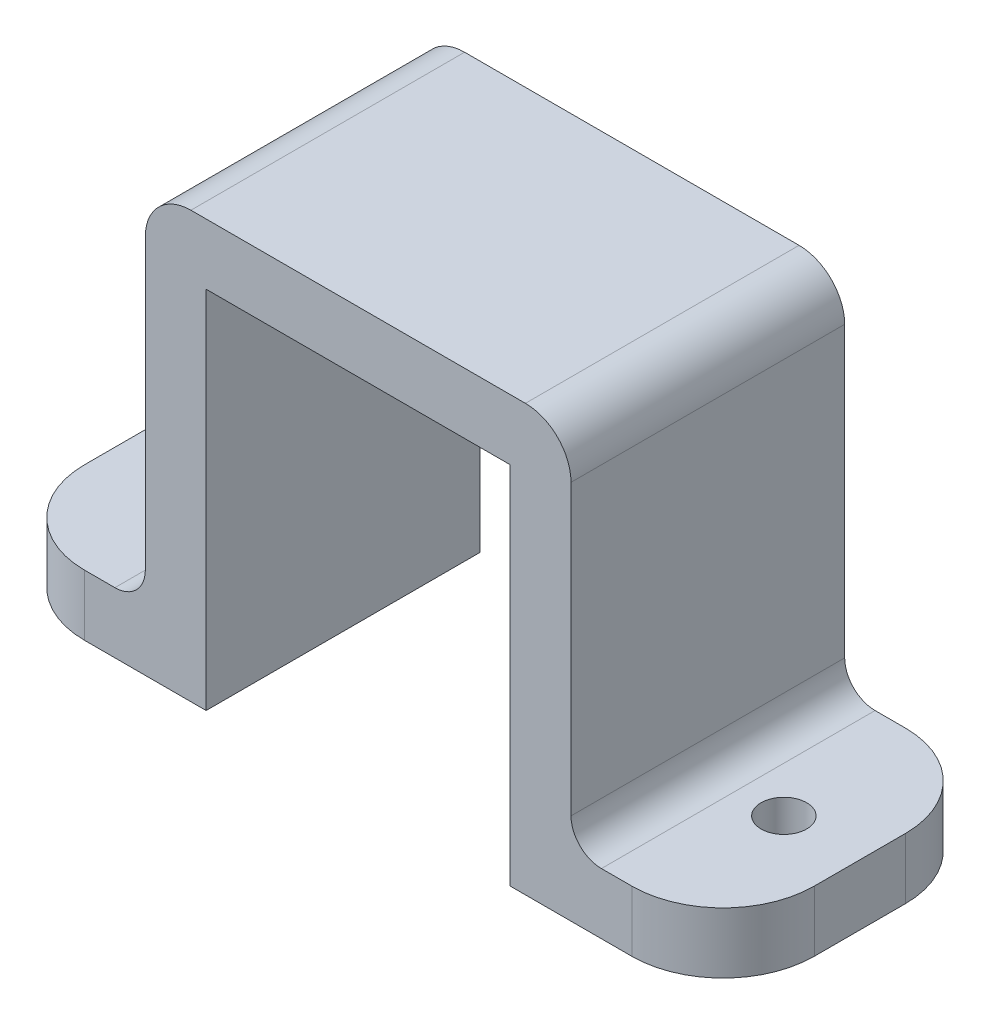
ISO-10303-21;
HEADER;
FILE_DESCRIPTION(('STEP AP214'),'2;1');
FILE_NAME('part.step','',(''),(''),'','','');
FILE_SCHEMA(('AUTOMOTIVE_DESIGN { 1 0 10303 214 1 1 1 1 }'));
ENDSEC;
DATA;
#1=APPLICATION_CONTEXT('core data for automotive mechanical design processes');
#2=APPLICATION_PROTOCOL_DEFINITION('international standard','automotive_design',2000,#1);
#3=PRODUCT_CONTEXT('',#1,'mechanical');
#4=PRODUCT('Part','Part','',(#3));
#5=PRODUCT_RELATED_PRODUCT_CATEGORY('part','',(#4));
#6=PRODUCT_DEFINITION_FORMATION('','',#4);
#7=PRODUCT_DEFINITION_CONTEXT('part definition',#1,'design');
#8=PRODUCT_DEFINITION('design','',#6,#7);
#9=PRODUCT_DEFINITION_SHAPE('','',#8);
#10=(LENGTH_UNIT() NAMED_UNIT(*) SI_UNIT(.MILLI.,.METRE.));
#11=(NAMED_UNIT(*) PLANE_ANGLE_UNIT() SI_UNIT($,.RADIAN.));
#12=(NAMED_UNIT(*) SI_UNIT($,.STERADIAN.) SOLID_ANGLE_UNIT());
#13=UNCERTAINTY_MEASURE_WITH_UNIT(LENGTH_MEASURE(1.E-05),#10,'distance_accuracy_value','');
#14=(GEOMETRIC_REPRESENTATION_CONTEXT(3) GLOBAL_UNCERTAINTY_ASSIGNED_CONTEXT((#13)) GLOBAL_UNIT_ASSIGNED_CONTEXT((#10,
#11,#12)) REPRESENTATION_CONTEXT('',''));
#15=CARTESIAN_POINT('',(0.,0.,0.));
#16=DIRECTION('',(0.,0.,1.));
#17=DIRECTION('',(1.,0.,0.));
#18=AXIS2_PLACEMENT_3D('',#15,#16,#17);
#19=CARTESIAN_POINT('',(0.,0.,9.));
#20=DIRECTION('',(0.,1.,0.));
#21=DIRECTION('',(-1.,0.,0.));
#22=AXIS2_PLACEMENT_3D('',#19,#20,#21);
#23=PLANE('',#22);
#24=CARTESIAN_POINT('',(-4.5,0.,4.5));
#25=DIRECTION('',(0.,1.,0.));
#26=DIRECTION('',(-1.,0.,0.));
#27=AXIS2_PLACEMENT_3D('',#24,#25,#26);
#28=CIRCLE('',#27,0.75);
#29=CARTESIAN_POINT('',(-5.25,0.,4.5));
#30=VERTEX_POINT('',#29);
#31=EDGE_CURVE('E663',#30,#30,#28,.T.);
#32=ORIENTED_EDGE('',*,*,#31,.T.);
#33=EDGE_LOOP('',(#32));
#34=FACE_BOUND('',#33,.T.);
#35=DIRECTION('',(0.,0.,-1.));
#36=VECTOR('',#35,1.);
#37=CARTESIAN_POINT('',(-7.,0.,9.));
#38=LINE('',#37,#36);
#39=CARTESIAN_POINT('',(-7.,0.,6.));
#40=VERTEX_POINT('',#39);
#41=CARTESIAN_POINT('',(-7.,0.,3.));
#42=VERTEX_POINT('',#41);
#43=EDGE_CURVE('E325',#40,#42,#38,.T.);
#44=ORIENTED_EDGE('',*,*,#43,.T.);
#45=CARTESIAN_POINT('',(-4.,0.,3.));
#46=DIRECTION('',(0.,1.,0.));
#47=DIRECTION('',(-1.,0.,0.));
#48=AXIS2_PLACEMENT_3D('',#45,#46,#47);
#49=CIRCLE('',#48,3.);
#50=CARTESIAN_POINT('',(-4.,0.,0.));
#51=VERTEX_POINT('',#50);
#52=EDGE_CURVE('E221',#42,#51,#49,.F.);
#53=ORIENTED_EDGE('',*,*,#52,.T.);
#54=DIRECTION('',(1.,0.,0.));
#55=VECTOR('',#54,1.);
#56=CARTESIAN_POINT('',(0.,0.,0.));
#57=LINE('',#56,#55);
#58=CARTESIAN_POINT('',(0.,0.,0.));
#59=VERTEX_POINT('',#58);
#60=EDGE_CURVE('E202',#51,#59,#57,.T.);
#61=ORIENTED_EDGE('',*,*,#60,.T.);
#62=DIRECTION('',(0.,0.,-1.));
#63=VECTOR('',#62,1.);
#64=CARTESIAN_POINT('',(0.,0.,9.));
#65=LINE('',#64,#63);
#66=CARTESIAN_POINT('',(0.,0.,9.));
#67=VERTEX_POINT('',#66);
#68=EDGE_CURVE('E193',#67,#59,#65,.T.);
#69=ORIENTED_EDGE('',*,*,#68,.F.);
#70=DIRECTION('',(1.,0.,0.));
#71=VECTOR('',#70,1.);
#72=CARTESIAN_POINT('',(0.,0.,9.));
#73=LINE('',#72,#71);
#74=CARTESIAN_POINT('',(-4.,0.,9.));
#75=VERTEX_POINT('',#74);
#76=EDGE_CURVE('E177',#75,#67,#73,.T.);
#77=ORIENTED_EDGE('',*,*,#76,.F.);
#78=CARTESIAN_POINT('',(-4.,0.,6.));
#79=DIRECTION('',(0.,1.,0.));
#80=DIRECTION('',(-1.,0.,0.));
#81=AXIS2_PLACEMENT_3D('',#78,#79,#80);
#82=CIRCLE('',#81,3.);
#83=EDGE_CURVE('E218',#75,#40,#82,.F.);
#84=ORIENTED_EDGE('',*,*,#83,.T.);
#85=EDGE_LOOP('',(#44,#53,#61,#69,#77,#84));
#86=FACE_BOUND('',#85,.T.);
#87=ADVANCED_FACE('F39',(#34,#86),#23,.F.);
#88=CARTESIAN_POINT('',(0.,0.,9.));
#89=DIRECTION('',(-1.,0.,0.));
#90=DIRECTION('',(0.,0.,1.));
#91=AXIS2_PLACEMENT_3D('',#88,#89,#90);
#92=PLANE('',#91);
#93=DIRECTION('',(0.,1.,0.));
#94=VECTOR('',#93,1.);
#95=CARTESIAN_POINT('',(0.,0.,0.));
#96=LINE('',#95,#94);
#97=CARTESIAN_POINT('',(0.,12.,0.));
#98=VERTEX_POINT('',#97);
#99=EDGE_CURVE('E385',#59,#98,#96,.T.);
#100=ORIENTED_EDGE('',*,*,#99,.T.);
#101=DIRECTION('',(0.,0.,-1.));
#102=VECTOR('',#101,1.);
#103=CARTESIAN_POINT('',(0.,12.,9.));
#104=LINE('',#103,#102);
#105=CARTESIAN_POINT('',(0.,12.,9.));
#106=VERTEX_POINT('',#105);
#107=EDGE_CURVE('E195',#106,#98,#104,.T.);
#108=ORIENTED_EDGE('',*,*,#107,.F.);
#109=DIRECTION('',(0.,1.,0.));
#110=VECTOR('',#109,1.);
#111=CARTESIAN_POINT('',(0.,0.,9.));
#112=LINE('',#111,#110);
#113=EDGE_CURVE('E181',#67,#106,#112,.T.);
#114=ORIENTED_EDGE('',*,*,#113,.F.);
#115=ORIENTED_EDGE('',*,*,#68,.T.);
#116=EDGE_LOOP('',(#100,#108,#114,#115));
#117=FACE_BOUND('',#116,.T.);
#118=ADVANCED_FACE('F192',(#117),#92,.F.);
#119=CARTESIAN_POINT('',(0.,12.,9.));
#120=DIRECTION('',(0.,1.,0.));
#121=DIRECTION('',(0.,0.,1.));
#122=AXIS2_PLACEMENT_3D('',#119,#120,#121);
#123=PLANE('',#122);
#124=DIRECTION('',(1.,0.,0.));
#125=VECTOR('',#124,1.);
#126=CARTESIAN_POINT('',(0.,12.,0.));
#127=LINE('',#126,#125);
#128=CARTESIAN_POINT('',(10.,12.,0.));
#129=VERTEX_POINT('',#128);
#130=EDGE_CURVE('E376',#98,#129,#127,.T.);
#131=ORIENTED_EDGE('',*,*,#130,.T.);
#132=DIRECTION('',(0.,0.,-1.));
#133=VECTOR('',#132,1.);
#134=CARTESIAN_POINT('',(10.,12.,9.));
#135=LINE('',#134,#133);
#136=CARTESIAN_POINT('',(10.,12.,9.));
#137=VERTEX_POINT('',#136);
#138=EDGE_CURVE('E211',#137,#129,#135,.T.);
#139=ORIENTED_EDGE('',*,*,#138,.F.);
#140=DIRECTION('',(1.,0.,0.));
#141=VECTOR('',#140,1.);
#142=CARTESIAN_POINT('',(0.,12.,9.));
#143=LINE('',#142,#141);
#144=EDGE_CURVE('E198',#106,#137,#143,.T.);
#145=ORIENTED_EDGE('',*,*,#144,.F.);
#146=ORIENTED_EDGE('',*,*,#107,.T.);
#147=EDGE_LOOP('',(#131,#139,#145,#146));
#148=FACE_BOUND('',#147,.T.);
#149=ADVANCED_FACE('F420',(#148),#123,.F.);
#150=CARTESIAN_POINT('',(10.,0.,9.));
#151=DIRECTION('',(1.,0.,0.));
#152=DIRECTION('',(0.,0.,-1.));
#153=AXIS2_PLACEMENT_3D('',#150,#151,#152);
#154=PLANE('',#153);
#155=DIRECTION('',(0.,-1.,0.));
#156=VECTOR('',#155,1.);
#157=CARTESIAN_POINT('',(10.,0.,0.));
#158=LINE('',#157,#156);
#159=CARTESIAN_POINT('',(10.,0.,0.));
#160=VERTEX_POINT('',#159);
#161=EDGE_CURVE('E371',#129,#160,#158,.T.);
#162=ORIENTED_EDGE('',*,*,#161,.T.);
#163=DIRECTION('',(0.,0.,-1.));
#164=VECTOR('',#163,1.);
#165=CARTESIAN_POINT('',(10.,0.,9.));
#166=LINE('',#165,#164);
#167=CARTESIAN_POINT('',(10.,0.,9.));
#168=VERTEX_POINT('',#167);
#169=EDGE_CURVE('E360',#168,#160,#166,.T.);
#170=ORIENTED_EDGE('',*,*,#169,.F.);
#171=DIRECTION('',(0.,-1.,0.));
#172=VECTOR('',#171,1.);
#173=CARTESIAN_POINT('',(10.,0.,9.));
#174=LINE('',#173,#172);
#175=EDGE_CURVE('E372',#137,#168,#174,.T.);
#176=ORIENTED_EDGE('',*,*,#175,.F.);
#177=ORIENTED_EDGE('',*,*,#138,.T.);
#178=EDGE_LOOP('',(#162,#170,#176,#177));
#179=FACE_BOUND('',#178,.T.);
#180=ADVANCED_FACE('F369',(#179),#154,.F.);
#181=CARTESIAN_POINT('',(10.,0.,9.));
#182=DIRECTION('',(0.,1.,0.));
#183=DIRECTION('',(0.,0.,1.));
#184=AXIS2_PLACEMENT_3D('',#181,#182,#183);
#185=PLANE('',#184);
#186=CARTESIAN_POINT('',(14.5,0.,4.5));
#187=DIRECTION('',(0.,1.,0.));
#188=DIRECTION('',(0.,0.,1.));
#189=AXIS2_PLACEMENT_3D('',#186,#187,#188);
#190=CIRCLE('',#189,0.75);
#191=CARTESIAN_POINT('',(14.5,0.,5.25));
#192=VERTEX_POINT('',#191);
#193=EDGE_CURVE('E418',#192,#192,#190,.T.);
#194=ORIENTED_EDGE('',*,*,#193,.T.);
#195=EDGE_LOOP('',(#194));
#196=FACE_BOUND('',#195,.T.);
#197=DIRECTION('',(1.,0.,0.));
#198=VECTOR('',#197,1.);
#199=CARTESIAN_POINT('',(10.,0.,0.));
#200=LINE('',#199,#198);
#201=CARTESIAN_POINT('',(14.,0.,0.));
#202=VERTEX_POINT('',#201);
#203=EDGE_CURVE('E378',#160,#202,#200,.T.);
#204=ORIENTED_EDGE('',*,*,#203,.T.);
#205=CARTESIAN_POINT('',(14.,0.,3.));
#206=DIRECTION('',(0.,1.,0.));
#207=DIRECTION('',(0.,0.,1.));
#208=AXIS2_PLACEMENT_3D('',#205,#206,#207);
#209=CIRCLE('',#208,3.);
#210=CARTESIAN_POINT('',(17.,0.,3.));
#211=VERTEX_POINT('',#210);
#212=EDGE_CURVE('E260',#202,#211,#209,.F.);
#213=ORIENTED_EDGE('',*,*,#212,.T.);
#214=DIRECTION('',(0.,0.,-1.));
#215=VECTOR('',#214,1.);
#216=CARTESIAN_POINT('',(17.,0.,9.));
#217=LINE('',#216,#215);
#218=CARTESIAN_POINT('',(17.,0.,6.));
#219=VERTEX_POINT('',#218);
#220=EDGE_CURVE('E356',#219,#211,#217,.T.);
#221=ORIENTED_EDGE('',*,*,#220,.F.);
#222=CARTESIAN_POINT('',(14.,0.,6.));
#223=DIRECTION('',(0.,1.,0.));
#224=DIRECTION('',(0.,0.,1.));
#225=AXIS2_PLACEMENT_3D('',#222,#223,#224);
#226=CIRCLE('',#225,3.);
#227=CARTESIAN_POINT('',(14.,0.,9.));
#228=VERTEX_POINT('',#227);
#229=EDGE_CURVE('E257',#219,#228,#226,.F.);
#230=ORIENTED_EDGE('',*,*,#229,.T.);
#231=DIRECTION('',(1.,0.,0.));
#232=VECTOR('',#231,1.);
#233=CARTESIAN_POINT('',(10.,0.,9.));
#234=LINE('',#233,#232);
#235=EDGE_CURVE('E424',#168,#228,#234,.T.);
#236=ORIENTED_EDGE('',*,*,#235,.F.);
#237=ORIENTED_EDGE('',*,*,#169,.T.);
#238=EDGE_LOOP('',(#204,#213,#221,#230,#236,#237));
#239=FACE_BOUND('',#238,.T.);
#240=ADVANCED_FACE('F507',(#196,#239),#185,.F.);
#241=CARTESIAN_POINT('',(17.,2.,9.));
#242=DIRECTION('',(-1.,0.,0.));
#243=DIRECTION('',(0.,0.,1.));
#244=AXIS2_PLACEMENT_3D('',#241,#242,#243);
#245=PLANE('',#244);
#246=ORIENTED_EDGE('',*,*,#220,.T.);
#247=DIRECTION('',(0.,1.,0.));
#248=VECTOR('',#247,1.);
#249=CARTESIAN_POINT('',(17.,2.,3.));
#250=LINE('',#249,#248);
#251=CARTESIAN_POINT('',(17.,2.,3.));
#252=VERTEX_POINT('',#251);
#253=EDGE_CURVE('E247',#211,#252,#250,.T.);
#254=ORIENTED_EDGE('',*,*,#253,.T.);
#255=DIRECTION('',(0.,0.,-1.));
#256=VECTOR('',#255,1.);
#257=CARTESIAN_POINT('',(17.,2.,9.));
#258=LINE('',#257,#256);
#259=CARTESIAN_POINT('',(17.,2.,6.));
#260=VERTEX_POINT('',#259);
#261=EDGE_CURVE('E352',#260,#252,#258,.T.);
#262=ORIENTED_EDGE('',*,*,#261,.F.);
#263=DIRECTION('',(0.,1.,0.));
#264=VECTOR('',#263,1.);
#265=CARTESIAN_POINT('',(17.,0.,6.));
#266=LINE('',#265,#264);
#267=EDGE_CURVE('E244',#260,#219,#266,.F.);
#268=ORIENTED_EDGE('',*,*,#267,.T.);
#269=EDGE_LOOP('',(#246,#254,#262,#268));
#270=FACE_BOUND('',#269,.T.);
#271=ADVANCED_FACE('F503',(#270),#245,.F.);
#272=CARTESIAN_POINT('',(12.,2.,9.));
#273=DIRECTION('',(0.,-1.,0.));
#274=DIRECTION('',(0.,0.,-1.));
#275=AXIS2_PLACEMENT_3D('',#272,#273,#274);
#276=PLANE('',#275);
#277=CARTESIAN_POINT('',(14.5,2.,4.5));
#278=DIRECTION('',(0.,1.,0.));
#279=DIRECTION('',(0.,0.,1.));
#280=AXIS2_PLACEMENT_3D('',#277,#278,#279);
#281=CIRCLE('',#280,0.75);
#282=CARTESIAN_POINT('',(14.5,2.,5.25));
#283=VERTEX_POINT('',#282);
#284=EDGE_CURVE('E669',#283,#283,#281,.T.);
#285=ORIENTED_EDGE('',*,*,#284,.F.);
#286=EDGE_LOOP('',(#285));
#287=FACE_BOUND('',#286,.T.);
#288=DIRECTION('',(-1.,0.,0.));
#289=VECTOR('',#288,1.);
#290=CARTESIAN_POINT('',(12.,2.,0.));
#291=LINE('',#290,#289);
#292=CARTESIAN_POINT('',(14.,2.,0.));
#293=VERTEX_POINT('',#292);
#294=CARTESIAN_POINT('',(13.,2.,0.));
#295=VERTEX_POINT('',#294);
#296=EDGE_CURVE('E383',#293,#295,#291,.T.);
#297=ORIENTED_EDGE('',*,*,#296,.T.);
#298=DIRECTION('',(0.,0.,-1.));
#299=VECTOR('',#298,1.);
#300=CARTESIAN_POINT('',(13.,2.,9.));
#301=LINE('',#300,#299);
#302=CARTESIAN_POINT('',(13.,2.,9.));
#303=VERTEX_POINT('',#302);
#304=EDGE_CURVE('E55',#295,#303,#301,.F.);
#305=ORIENTED_EDGE('',*,*,#304,.T.);
#306=DIRECTION('',(-1.,0.,0.));
#307=VECTOR('',#306,1.);
#308=CARTESIAN_POINT('',(12.,2.,9.));
#309=LINE('',#308,#307);
#310=CARTESIAN_POINT('',(14.,2.,9.));
#311=VERTEX_POINT('',#310);
#312=EDGE_CURVE('E413',#311,#303,#309,.T.);
#313=ORIENTED_EDGE('',*,*,#312,.F.);
#314=CARTESIAN_POINT('',(14.,2.,6.));
#315=DIRECTION('',(0.,-1.,0.));
#316=DIRECTION('',(0.,0.,-1.));
#317=AXIS2_PLACEMENT_3D('',#314,#315,#316);
#318=CIRCLE('',#317,3.);
#319=EDGE_CURVE('E251',#311,#260,#318,.F.);
#320=ORIENTED_EDGE('',*,*,#319,.T.);
#321=ORIENTED_EDGE('',*,*,#261,.T.);
#322=CARTESIAN_POINT('',(14.,2.,3.));
#323=DIRECTION('',(0.,-1.,0.));
#324=DIRECTION('',(0.,0.,-1.));
#325=AXIS2_PLACEMENT_3D('',#322,#323,#324);
#326=CIRCLE('',#325,3.);
#327=EDGE_CURVE('E254',#252,#293,#326,.F.);
#328=ORIENTED_EDGE('',*,*,#327,.T.);
#329=EDGE_LOOP('',(#297,#305,#313,#320,#321,#328));
#330=FACE_BOUND('',#329,.T.);
#331=ADVANCED_FACE('F500',(#287,#330),#276,.F.);
#332=CARTESIAN_POINT('',(12.,2.,9.));
#333=DIRECTION('',(-1.,0.,0.));
#334=DIRECTION('',(0.,0.,1.));
#335=AXIS2_PLACEMENT_3D('',#332,#333,#334);
#336=PLANE('',#335);
#337=DIRECTION('',(0.,1.,0.));
#338=VECTOR('',#337,1.);
#339=CARTESIAN_POINT('',(12.,2.,9.));
#340=LINE('',#339,#338);
#341=CARTESIAN_POINT('',(12.,3.,9.));
#342=VERTEX_POINT('',#341);
#343=CARTESIAN_POINT('',(12.,12.5,9.));
#344=VERTEX_POINT('',#343);
#345=EDGE_CURVE('E404',#342,#344,#340,.T.);
#346=ORIENTED_EDGE('',*,*,#345,.F.);
#347=DIRECTION('',(0.,0.,-1.));
#348=VECTOR('',#347,1.);
#349=CARTESIAN_POINT('',(12.,3.,0.));
#350=LINE('',#349,#348);
#351=CARTESIAN_POINT('',(12.,3.,0.));
#352=VERTEX_POINT('',#351);
#353=EDGE_CURVE('E298',#342,#352,#350,.T.);
#354=ORIENTED_EDGE('',*,*,#353,.T.);
#355=DIRECTION('',(0.,1.,0.));
#356=VECTOR('',#355,1.);
#357=CARTESIAN_POINT('',(12.,2.,0.));
#358=LINE('',#357,#356);
#359=CARTESIAN_POINT('',(12.,12.5,0.));
#360=VERTEX_POINT('',#359);
#361=EDGE_CURVE('E342',#352,#360,#358,.T.);
#362=ORIENTED_EDGE('',*,*,#361,.T.);
#363=DIRECTION('',(0.,0.,-1.));
#364=VECTOR('',#363,1.);
#365=CARTESIAN_POINT('',(12.,12.5,9.));
#366=LINE('',#365,#364);
#367=EDGE_CURVE('E287',#360,#344,#366,.F.);
#368=ORIENTED_EDGE('',*,*,#367,.T.);
#369=EDGE_LOOP('',(#346,#354,#362,#368));
#370=FACE_BOUND('',#369,.T.);
#371=ADVANCED_FACE('F393',(#370),#336,.F.);
#372=CARTESIAN_POINT('',(-2.,14.,9.));
#373=DIRECTION('',(0.,-1.,0.));
#374=DIRECTION('',(0.,0.,-1.));
#375=AXIS2_PLACEMENT_3D('',#372,#373,#374);
#376=PLANE('',#375);
#377=DIRECTION('',(-1.,0.,0.));
#378=VECTOR('',#377,1.);
#379=CARTESIAN_POINT('',(-2.,14.,0.));
#380=LINE('',#379,#378);
#381=CARTESIAN_POINT('',(10.5,14.,0.));
#382=VERTEX_POINT('',#381);
#383=CARTESIAN_POINT('',(-0.5,14.,0.));
#384=VERTEX_POINT('',#383);
#385=EDGE_CURVE('E336',#382,#384,#380,.T.);
#386=ORIENTED_EDGE('',*,*,#385,.T.);
#387=DIRECTION('',(0.,0.,-1.));
#388=VECTOR('',#387,1.);
#389=CARTESIAN_POINT('',(-0.5,14.,9.));
#390=LINE('',#389,#388);
#391=CARTESIAN_POINT('',(-0.5,14.,9.));
#392=VERTEX_POINT('',#391);
#393=EDGE_CURVE('E278',#384,#392,#390,.F.);
#394=ORIENTED_EDGE('',*,*,#393,.T.);
#395=DIRECTION('',(-1.,0.,0.));
#396=VECTOR('',#395,1.);
#397=CARTESIAN_POINT('',(-2.,14.,9.));
#398=LINE('',#397,#396);
#399=CARTESIAN_POINT('',(10.5,14.,9.));
#400=VERTEX_POINT('',#399);
#401=EDGE_CURVE('E402',#400,#392,#398,.T.);
#402=ORIENTED_EDGE('',*,*,#401,.F.);
#403=DIRECTION('',(0.,0.,-1.));
#404=VECTOR('',#403,1.);
#405=CARTESIAN_POINT('',(10.5,14.,9.));
#406=LINE('',#405,#404);
#407=EDGE_CURVE('E274',#400,#382,#406,.T.);
#408=ORIENTED_EDGE('',*,*,#407,.T.);
#409=EDGE_LOOP('',(#386,#394,#402,#408));
#410=FACE_BOUND('',#409,.T.);
#411=ADVANCED_FACE('F406',(#410),#376,.F.);
#412=CARTESIAN_POINT('',(-2.,2.,9.));
#413=DIRECTION('',(1.,0.,0.));
#414=DIRECTION('',(0.,0.,-1.));
#415=AXIS2_PLACEMENT_3D('',#412,#413,#414);
#416=PLANE('',#415);
#417=DIRECTION('',(0.,-1.,0.));
#418=VECTOR('',#417,1.);
#419=CARTESIAN_POINT('',(-2.,2.,0.));
#420=LINE('',#419,#418);
#421=CARTESIAN_POINT('',(-2.,12.5,0.));
#422=VERTEX_POINT('',#421);
#423=CARTESIAN_POINT('',(-2.,3.,0.));
#424=VERTEX_POINT('',#423);
#425=EDGE_CURVE('E331',#422,#424,#420,.T.);
#426=ORIENTED_EDGE('',*,*,#425,.T.);
#427=DIRECTION('',(0.,0.,-1.));
#428=VECTOR('',#427,1.);
#429=CARTESIAN_POINT('',(-2.,3.,9.));
#430=LINE('',#429,#428);
#431=CARTESIAN_POINT('',(-2.,3.,9.));
#432=VERTEX_POINT('',#431);
#433=EDGE_CURVE('E295',#424,#432,#430,.F.);
#434=ORIENTED_EDGE('',*,*,#433,.T.);
#435=DIRECTION('',(0.,-1.,0.));
#436=VECTOR('',#435,1.);
#437=CARTESIAN_POINT('',(-2.,2.,9.));
#438=LINE('',#437,#436);
#439=CARTESIAN_POINT('',(-2.,12.5,9.));
#440=VERTEX_POINT('',#439);
#441=EDGE_CURVE('E315',#440,#432,#438,.T.);
#442=ORIENTED_EDGE('',*,*,#441,.F.);
#443=DIRECTION('',(0.,0.,-1.));
#444=VECTOR('',#443,1.);
#445=CARTESIAN_POINT('',(-2.,12.5,9.));
#446=LINE('',#445,#444);
#447=EDGE_CURVE('E263',#440,#422,#446,.T.);
#448=ORIENTED_EDGE('',*,*,#447,.T.);
#449=EDGE_LOOP('',(#426,#434,#442,#448));
#450=FACE_BOUND('',#449,.T.);
#451=ADVANCED_FACE('F333',(#450),#416,.F.);
#452=CARTESIAN_POINT('',(-2.,2.,9.));
#453=DIRECTION('',(0.,-1.,0.));
#454=DIRECTION('',(0.,0.,-1.));
#455=AXIS2_PLACEMENT_3D('',#452,#453,#454);
#456=PLANE('',#455);
#457=CARTESIAN_POINT('',(-4.5,2.,4.5));
#458=DIRECTION('',(0.,1.,0.));
#459=DIRECTION('',(0.,0.,1.));
#460=AXIS2_PLACEMENT_3D('',#457,#458,#459);
#461=CIRCLE('',#460,0.75);
#462=CARTESIAN_POINT('',(-4.5,2.,5.25));
#463=VERTEX_POINT('',#462);
#464=EDGE_CURVE('E666',#463,#463,#461,.T.);
#465=ORIENTED_EDGE('',*,*,#464,.F.);
#466=EDGE_LOOP('',(#465));
#467=FACE_BOUND('',#466,.T.);
#468=DIRECTION('',(-1.,0.,0.));
#469=VECTOR('',#468,1.);
#470=CARTESIAN_POINT('',(-2.,2.,9.));
#471=LINE('',#470,#469);
#472=CARTESIAN_POINT('',(-3.,2.,9.));
#473=VERTEX_POINT('',#472);
#474=CARTESIAN_POINT('',(-4.,2.,9.));
#475=VERTEX_POINT('',#474);
#476=EDGE_CURVE('E313',#473,#475,#471,.T.);
#477=ORIENTED_EDGE('',*,*,#476,.F.);
#478=DIRECTION('',(0.,0.,-1.));
#479=VECTOR('',#478,1.);
#480=CARTESIAN_POINT('',(-3.,2.,0.));
#481=LINE('',#480,#479);
#482=CARTESIAN_POINT('',(-3.,2.,0.));
#483=VERTEX_POINT('',#482);
#484=EDGE_CURVE('E291',#473,#483,#481,.T.);
#485=ORIENTED_EDGE('',*,*,#484,.T.);
#486=DIRECTION('',(-1.,0.,0.));
#487=VECTOR('',#486,1.);
#488=CARTESIAN_POINT('',(-2.,2.,0.));
#489=LINE('',#488,#487);
#490=CARTESIAN_POINT('',(-4.,2.,0.));
#491=VERTEX_POINT('',#490);
#492=EDGE_CURVE('E188',#483,#491,#489,.T.);
#493=ORIENTED_EDGE('',*,*,#492,.T.);
#494=CARTESIAN_POINT('',(-4.,2.,3.));
#495=DIRECTION('',(0.,-1.,0.));
#496=DIRECTION('',(0.,0.,-1.));
#497=AXIS2_PLACEMENT_3D('',#494,#495,#496);
#498=CIRCLE('',#497,3.);
#499=CARTESIAN_POINT('',(-7.,2.,3.));
#500=VERTEX_POINT('',#499);
#501=EDGE_CURVE('E235',#491,#500,#498,.F.);
#502=ORIENTED_EDGE('',*,*,#501,.T.);
#503=DIRECTION('',(0.,0.,-1.));
#504=VECTOR('',#503,1.);
#505=CARTESIAN_POINT('',(-7.,2.,9.));
#506=LINE('',#505,#504);
#507=CARTESIAN_POINT('',(-7.,2.,6.));
#508=VERTEX_POINT('',#507);
#509=EDGE_CURVE('E348',#508,#500,#506,.T.);
#510=ORIENTED_EDGE('',*,*,#509,.F.);
#511=CARTESIAN_POINT('',(-4.,2.,6.));
#512=DIRECTION('',(0.,-1.,0.));
#513=DIRECTION('',(0.,0.,-1.));
#514=AXIS2_PLACEMENT_3D('',#511,#512,#513);
#515=CIRCLE('',#514,3.);
#516=EDGE_CURVE('E231',#508,#475,#515,.F.);
#517=ORIENTED_EDGE('',*,*,#516,.T.);
#518=EDGE_LOOP('',(#477,#485,#493,#502,#510,#517));
#519=FACE_BOUND('',#518,.T.);
#520=ADVANCED_FACE('F320',(#467,#519),#456,.F.);
#521=CARTESIAN_POINT('',(-7.,2.,9.));
#522=DIRECTION('',(1.,0.,0.));
#523=DIRECTION('',(0.,0.,-1.));
#524=AXIS2_PLACEMENT_3D('',#521,#522,#523);
#525=PLANE('',#524);
#526=ORIENTED_EDGE('',*,*,#509,.T.);
#527=DIRECTION('',(0.,-1.,0.));
#528=VECTOR('',#527,1.);
#529=CARTESIAN_POINT('',(-7.,2.,3.));
#530=LINE('',#529,#528);
#531=EDGE_CURVE('E209',#500,#42,#530,.T.);
#532=ORIENTED_EDGE('',*,*,#531,.T.);
#533=ORIENTED_EDGE('',*,*,#43,.F.);
#534=DIRECTION('',(0.,-1.,0.));
#535=VECTOR('',#534,1.);
#536=CARTESIAN_POINT('',(-7.,2.,6.));
#537=LINE('',#536,#535);
#538=EDGE_CURVE('E205',#40,#508,#537,.F.);
#539=ORIENTED_EDGE('',*,*,#538,.T.);
#540=EDGE_LOOP('',(#526,#532,#533,#539));
#541=FACE_BOUND('',#540,.T.);
#542=ADVANCED_FACE('F485',(#541),#525,.F.);
#543=CARTESIAN_POINT('',(0.,0.,9.));
#544=DIRECTION('',(0.,0.,1.));
#545=DIRECTION('',(1.,0.,0.));
#546=AXIS2_PLACEMENT_3D('',#543,#544,#545);
#547=PLANE('',#546);
#548=ORIENTED_EDGE('',*,*,#401,.T.);
#549=CARTESIAN_POINT('',(-0.5,12.5,9.));
#550=DIRECTION('',(0.,0.,1.));
#551=DIRECTION('',(1.,0.,0.));
#552=AXIS2_PLACEMENT_3D('',#549,#550,#551);
#553=CIRCLE('',#552,1.5);
#554=EDGE_CURVE('E284',#392,#440,#553,.T.);
#555=ORIENTED_EDGE('',*,*,#554,.T.);
#556=ORIENTED_EDGE('',*,*,#441,.T.);
#557=CARTESIAN_POINT('',(-3.,3.,9.));
#558=DIRECTION('',(0.,0.,1.));
#559=DIRECTION('',(1.,0.,0.));
#560=AXIS2_PLACEMENT_3D('',#557,#558,#559);
#561=CIRCLE('',#560,1.);
#562=EDGE_CURVE('E307',#432,#473,#561,.F.);
#563=ORIENTED_EDGE('',*,*,#562,.T.);
#564=ORIENTED_EDGE('',*,*,#476,.T.);
#565=DIRECTION('',(0.,-1.,0.));
#566=VECTOR('',#565,1.);
#567=CARTESIAN_POINT('',(-4.,0.,9.));
#568=LINE('',#567,#566);
#569=EDGE_CURVE('E184',#475,#75,#568,.T.);
#570=ORIENTED_EDGE('',*,*,#569,.T.);
#571=ORIENTED_EDGE('',*,*,#76,.T.);
#572=ORIENTED_EDGE('',*,*,#113,.T.);
#573=ORIENTED_EDGE('',*,*,#144,.T.);
#574=ORIENTED_EDGE('',*,*,#175,.T.);
#575=ORIENTED_EDGE('',*,*,#235,.T.);
#576=DIRECTION('',(0.,1.,0.));
#577=VECTOR('',#576,1.);
#578=CARTESIAN_POINT('',(14.,2.,9.));
#579=LINE('',#578,#577);
#580=EDGE_CURVE('E238',#228,#311,#579,.T.);
#581=ORIENTED_EDGE('',*,*,#580,.T.);
#582=ORIENTED_EDGE('',*,*,#312,.T.);
#583=CARTESIAN_POINT('',(13.,3.,9.));
#584=DIRECTION('',(0.,0.,1.));
#585=DIRECTION('',(1.,0.,0.));
#586=AXIS2_PLACEMENT_3D('',#583,#584,#585);
#587=CIRCLE('',#586,1.);
#588=EDGE_CURVE('E11',#303,#342,#587,.F.);
#589=ORIENTED_EDGE('',*,*,#588,.T.);
#590=ORIENTED_EDGE('',*,*,#345,.T.);
#591=CARTESIAN_POINT('',(10.5,12.5,9.));
#592=DIRECTION('',(0.,0.,1.));
#593=DIRECTION('',(1.,0.,0.));
#594=AXIS2_PLACEMENT_3D('',#591,#592,#593);
#595=CIRCLE('',#594,1.5);
#596=EDGE_CURVE('E281',#344,#400,#595,.T.);
#597=ORIENTED_EDGE('',*,*,#596,.T.);
#598=EDGE_LOOP('',(#548,#555,#556,#563,#564,#570,#571,#572,#573,#574,#575,#581,#582,#589,#590,#597));
#599=FACE_BOUND('',#598,.T.);
#600=ADVANCED_FACE('F180',(#599),#547,.T.);
#601=CARTESIAN_POINT('',(0.,0.,0.));
#602=DIRECTION('',(0.,0.,1.));
#603=DIRECTION('',(1.,0.,0.));
#604=AXIS2_PLACEMENT_3D('',#601,#602,#603);
#605=PLANE('',#604);
#606=ORIENTED_EDGE('',*,*,#425,.F.);
#607=CARTESIAN_POINT('',(-0.5,12.5,0.));
#608=DIRECTION('',(0.,0.,1.));
#609=DIRECTION('',(1.,0.,0.));
#610=AXIS2_PLACEMENT_3D('',#607,#608,#609);
#611=CIRCLE('',#610,1.5);
#612=EDGE_CURVE('E271',#422,#384,#611,.F.);
#613=ORIENTED_EDGE('',*,*,#612,.T.);
#614=ORIENTED_EDGE('',*,*,#385,.F.);
#615=CARTESIAN_POINT('',(10.5,12.5,0.));
#616=DIRECTION('',(0.,0.,1.));
#617=DIRECTION('',(1.,0.,0.));
#618=AXIS2_PLACEMENT_3D('',#615,#616,#617);
#619=CIRCLE('',#618,1.5);
#620=EDGE_CURVE('E267',#382,#360,#619,.F.);
#621=ORIENTED_EDGE('',*,*,#620,.T.);
#622=ORIENTED_EDGE('',*,*,#361,.F.);
#623=CARTESIAN_POINT('',(13.,3.,0.));
#624=DIRECTION('',(0.,0.,1.));
#625=DIRECTION('',(1.,0.,0.));
#626=AXIS2_PLACEMENT_3D('',#623,#624,#625);
#627=CIRCLE('',#626,1.);
#628=EDGE_CURVE('E48',#352,#295,#627,.T.);
#629=ORIENTED_EDGE('',*,*,#628,.T.);
#630=ORIENTED_EDGE('',*,*,#296,.F.);
#631=DIRECTION('',(0.,1.,0.));
#632=VECTOR('',#631,1.);
#633=CARTESIAN_POINT('',(14.,0.,0.));
#634=LINE('',#633,#632);
#635=EDGE_CURVE('E224',#293,#202,#634,.F.);
#636=ORIENTED_EDGE('',*,*,#635,.T.);
#637=ORIENTED_EDGE('',*,*,#203,.F.);
#638=ORIENTED_EDGE('',*,*,#161,.F.);
#639=ORIENTED_EDGE('',*,*,#130,.F.);
#640=ORIENTED_EDGE('',*,*,#99,.F.);
#641=ORIENTED_EDGE('',*,*,#60,.F.);
#642=DIRECTION('',(0.,-1.,0.));
#643=VECTOR('',#642,1.);
#644=CARTESIAN_POINT('',(-4.,0.,0.));
#645=LINE('',#644,#643);
#646=EDGE_CURVE('E227',#51,#491,#645,.F.);
#647=ORIENTED_EDGE('',*,*,#646,.T.);
#648=ORIENTED_EDGE('',*,*,#492,.F.);
#649=CARTESIAN_POINT('',(-3.,3.,0.));
#650=DIRECTION('',(0.,0.,1.));
#651=DIRECTION('',(1.,0.,0.));
#652=AXIS2_PLACEMENT_3D('',#649,#650,#651);
#653=CIRCLE('',#652,1.);
#654=EDGE_CURVE('E304',#483,#424,#653,.T.);
#655=ORIENTED_EDGE('',*,*,#654,.T.);
#656=EDGE_LOOP('',(#606,#613,#614,#621,#622,#629,#630,#636,#637,#638,#639,#640,#641,#647,#648,#655));
#657=FACE_BOUND('',#656,.T.);
#658=ADVANCED_FACE('F330',(#657),#605,.F.);
#659=CARTESIAN_POINT('',(-4.,2.,3.));
#660=DIRECTION('',(0.,-1.,0.));
#661=DIRECTION('',(0.,0.,-1.));
#662=AXIS2_PLACEMENT_3D('',#659,#660,#661);
#663=CYLINDRICAL_SURFACE('',#662,3.);
#664=ORIENTED_EDGE('',*,*,#501,.F.);
#665=ORIENTED_EDGE('',*,*,#646,.F.);
#666=ORIENTED_EDGE('',*,*,#52,.F.);
#667=ORIENTED_EDGE('',*,*,#531,.F.);
#668=EDGE_LOOP('',(#664,#665,#666,#667));
#669=FACE_BOUND('',#668,.T.);
#670=ADVANCED_FACE('F448',(#669),#663,.T.);
#671=CARTESIAN_POINT('',(-4.,0.,6.));
#672=DIRECTION('',(0.,1.,0.));
#673=DIRECTION('',(0.,0.,1.));
#674=AXIS2_PLACEMENT_3D('',#671,#672,#673);
#675=CYLINDRICAL_SURFACE('',#674,3.);
#676=ORIENTED_EDGE('',*,*,#516,.F.);
#677=ORIENTED_EDGE('',*,*,#538,.F.);
#678=ORIENTED_EDGE('',*,*,#83,.F.);
#679=ORIENTED_EDGE('',*,*,#569,.F.);
#680=EDGE_LOOP('',(#676,#677,#678,#679));
#681=FACE_BOUND('',#680,.T.);
#682=ADVANCED_FACE('F451',(#681),#675,.T.);
#683=CARTESIAN_POINT('',(14.,2.,3.));
#684=DIRECTION('',(0.,1.,0.));
#685=DIRECTION('',(0.,0.,1.));
#686=AXIS2_PLACEMENT_3D('',#683,#684,#685);
#687=CYLINDRICAL_SURFACE('',#686,3.);
#688=ORIENTED_EDGE('',*,*,#212,.F.);
#689=ORIENTED_EDGE('',*,*,#635,.F.);
#690=ORIENTED_EDGE('',*,*,#327,.F.);
#691=ORIENTED_EDGE('',*,*,#253,.F.);
#692=EDGE_LOOP('',(#688,#689,#690,#691));
#693=FACE_BOUND('',#692,.T.);
#694=ADVANCED_FACE('F455',(#693),#687,.T.);
#695=CARTESIAN_POINT('',(14.,0.,6.));
#696=DIRECTION('',(0.,-1.,0.));
#697=DIRECTION('',(0.,0.,-1.));
#698=AXIS2_PLACEMENT_3D('',#695,#696,#697);
#699=CYLINDRICAL_SURFACE('',#698,3.);
#700=ORIENTED_EDGE('',*,*,#229,.F.);
#701=ORIENTED_EDGE('',*,*,#267,.F.);
#702=ORIENTED_EDGE('',*,*,#319,.F.);
#703=ORIENTED_EDGE('',*,*,#580,.F.);
#704=EDGE_LOOP('',(#700,#701,#702,#703));
#705=FACE_BOUND('',#704,.T.);
#706=ADVANCED_FACE('F459',(#705),#699,.T.);
#707=CARTESIAN_POINT('',(-0.5,12.5,9.));
#708=DIRECTION('',(0.,0.,-1.));
#709=DIRECTION('',(-1.,0.,0.));
#710=AXIS2_PLACEMENT_3D('',#707,#708,#709);
#711=CYLINDRICAL_SURFACE('',#710,1.5);
#712=ORIENTED_EDGE('',*,*,#554,.F.);
#713=ORIENTED_EDGE('',*,*,#393,.F.);
#714=ORIENTED_EDGE('',*,*,#612,.F.);
#715=ORIENTED_EDGE('',*,*,#447,.F.);
#716=EDGE_LOOP('',(#712,#713,#714,#715));
#717=FACE_BOUND('',#716,.T.);
#718=ADVANCED_FACE('F463',(#717),#711,.T.);
#719=CARTESIAN_POINT('',(10.5,12.5,9.));
#720=DIRECTION('',(0.,0.,-1.));
#721=DIRECTION('',(-1.,0.,0.));
#722=AXIS2_PLACEMENT_3D('',#719,#720,#721);
#723=CYLINDRICAL_SURFACE('',#722,1.5);
#724=ORIENTED_EDGE('',*,*,#596,.F.);
#725=ORIENTED_EDGE('',*,*,#367,.F.);
#726=ORIENTED_EDGE('',*,*,#620,.F.);
#727=ORIENTED_EDGE('',*,*,#407,.F.);
#728=EDGE_LOOP('',(#724,#725,#726,#727));
#729=FACE_BOUND('',#728,.T.);
#730=ADVANCED_FACE('F400',(#729),#723,.T.);
#731=CARTESIAN_POINT('',(-4.5,-7.,4.5));
#732=DIRECTION('',(0.,1.,0.));
#733=DIRECTION('',(0.,0.,1.));
#734=AXIS2_PLACEMENT_3D('',#731,#732,#733);
#735=CYLINDRICAL_SURFACE('',#734,0.75);
#736=ORIENTED_EDGE('',*,*,#464,.T.);
#737=EDGE_LOOP('',(#736));
#738=FACE_BOUND('',#737,.T.);
#739=ORIENTED_EDGE('',*,*,#31,.F.);
#740=EDGE_LOOP('',(#739));
#741=FACE_BOUND('',#740,.T.);
#742=ADVANCED_FACE('F469',(#738,#741),#735,.F.);
#743=CARTESIAN_POINT('',(14.5,-7.,4.5));
#744=DIRECTION('',(0.,1.,0.));
#745=DIRECTION('',(0.,0.,1.));
#746=AXIS2_PLACEMENT_3D('',#743,#744,#745);
#747=CYLINDRICAL_SURFACE('',#746,0.75);
#748=ORIENTED_EDGE('',*,*,#284,.T.);
#749=EDGE_LOOP('',(#748));
#750=FACE_BOUND('',#749,.T.);
#751=ORIENTED_EDGE('',*,*,#193,.F.);
#752=EDGE_LOOP('',(#751));
#753=FACE_BOUND('',#752,.T.);
#754=ADVANCED_FACE('F437',(#750,#753),#747,.F.);
#755=CARTESIAN_POINT('',(-3.,3.,9.));
#756=DIRECTION('',(0.,0.,1.));
#757=DIRECTION('',(1.,0.,0.));
#758=AXIS2_PLACEMENT_3D('',#755,#756,#757);
#759=CYLINDRICAL_SURFACE('',#758,1.);
#760=ORIENTED_EDGE('',*,*,#562,.F.);
#761=ORIENTED_EDGE('',*,*,#433,.F.);
#762=ORIENTED_EDGE('',*,*,#654,.F.);
#763=ORIENTED_EDGE('',*,*,#484,.F.);
#764=EDGE_LOOP('',(#760,#761,#762,#763));
#765=FACE_BOUND('',#764,.T.);
#766=ADVANCED_FACE('F327',(#765),#759,.F.);
#767=CARTESIAN_POINT('',(13.,3.,9.));
#768=DIRECTION('',(0.,0.,1.));
#769=DIRECTION('',(1.,0.,0.));
#770=AXIS2_PLACEMENT_3D('',#767,#768,#769);
#771=CYLINDRICAL_SURFACE('',#770,1.);
#772=ORIENTED_EDGE('',*,*,#588,.F.);
#773=ORIENTED_EDGE('',*,*,#304,.F.);
#774=ORIENTED_EDGE('',*,*,#628,.F.);
#775=ORIENTED_EDGE('',*,*,#353,.F.);
#776=EDGE_LOOP('',(#772,#773,#774,#775));
#777=FACE_BOUND('',#776,.T.);
#778=ADVANCED_FACE('F41',(#777),#771,.F.);
#779=CLOSED_SHELL('',(#87,#118,#149,#180,#240,#271,#331,#371,#411,#451,#520,#542,#600,#658,#670,
#682,#694,#706,#718,#730,#742,#754,#766,#778));
#780=MANIFOLD_SOLID_BREP('B2',#779);
#781=ADVANCED_BREP_SHAPE_REPRESENTATION('',(#18,#780),#14);
#782=SHAPE_DEFINITION_REPRESENTATION(#9,#781);
ENDSEC;
END-ISO-10303-21;
